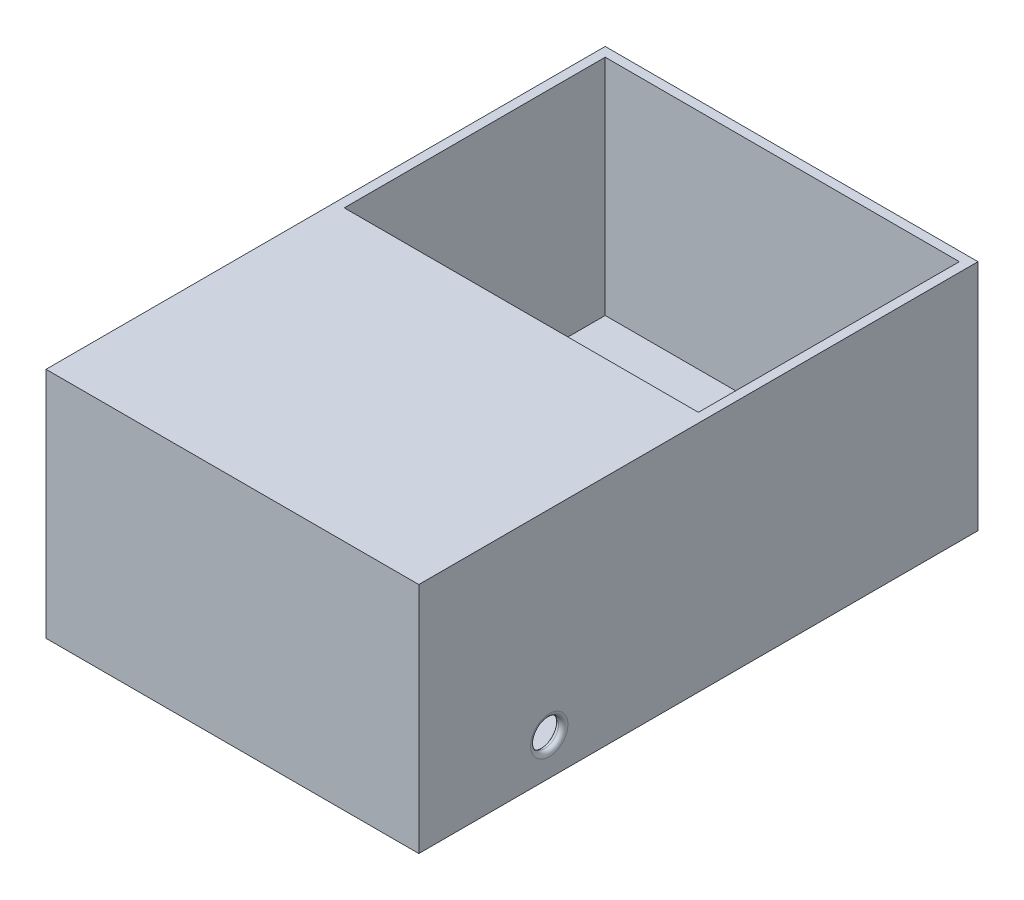
ISO-10303-21;
HEADER;
FILE_DESCRIPTION(('STEP AP214'),'2;1');
FILE_NAME('part.step','',(''),(''),'','','');
FILE_SCHEMA(('AUTOMOTIVE_DESIGN { 1 0 10303 214 1 1 1 1 }'));
ENDSEC;
DATA;
#1=APPLICATION_CONTEXT('core data for automotive mechanical design processes');
#2=APPLICATION_PROTOCOL_DEFINITION('international standard','automotive_design',2000,#1);
#3=PRODUCT_CONTEXT('',#1,'mechanical');
#4=PRODUCT('Part','Part','',(#3));
#5=PRODUCT_RELATED_PRODUCT_CATEGORY('part','',(#4));
#6=PRODUCT_DEFINITION_FORMATION('','',#4);
#7=PRODUCT_DEFINITION_CONTEXT('part definition',#1,'design');
#8=PRODUCT_DEFINITION('design','',#6,#7);
#9=PRODUCT_DEFINITION_SHAPE('','',#8);
#10=(LENGTH_UNIT() NAMED_UNIT(*) SI_UNIT(.MILLI.,.METRE.));
#11=(NAMED_UNIT(*) PLANE_ANGLE_UNIT() SI_UNIT($,.RADIAN.));
#12=(NAMED_UNIT(*) SI_UNIT($,.STERADIAN.) SOLID_ANGLE_UNIT());
#13=UNCERTAINTY_MEASURE_WITH_UNIT(LENGTH_MEASURE(1.E-05),#10,'distance_accuracy_value','');
#14=(GEOMETRIC_REPRESENTATION_CONTEXT(3) GLOBAL_UNCERTAINTY_ASSIGNED_CONTEXT((#13)) GLOBAL_UNIT_ASSIGNED_CONTEXT((#10,
#11,#12)) REPRESENTATION_CONTEXT('',''));
#15=CARTESIAN_POINT('',(0.,0.,0.));
#16=DIRECTION('',(0.,0.,1.));
#17=DIRECTION('',(1.,0.,0.));
#18=AXIS2_PLACEMENT_3D('',#15,#16,#17);
#19=CARTESIAN_POINT('',(-95.,125.,-145.));
#20=DIRECTION('',(1.,0.,0.));
#21=DIRECTION('',(0.,0.,-1.));
#22=AXIS2_PLACEMENT_3D('',#19,#20,#21);
#23=PLANE('',#22);
#24=CARTESIAN_POINT('',(-95.,20.,80.));
#25=DIRECTION('',(1.,0.,0.));
#26=DIRECTION('',(0.,0.,-1.));
#27=AXIS2_PLACEMENT_3D('',#24,#25,#26);
#28=CIRCLE('',#27,10.);
#29=CARTESIAN_POINT('',(-95.,20.,70.));
#30=VERTEX_POINT('',#29);
#31=EDGE_CURVE('E239',#30,#30,#28,.F.);
#32=ORIENTED_EDGE('',*,*,#31,.T.);
#33=EDGE_LOOP('',(#32));
#34=FACE_BOUND('',#33,.T.);
#35=DIRECTION('',(0.,1.,0.));
#36=VECTOR('',#35,1.);
#37=CARTESIAN_POINT('',(-95.,125.,-4.99999999999995));
#38=LINE('',#37,#36);
#39=CARTESIAN_POINT('',(-95.,120.,-4.99999999999995));
#40=VERTEX_POINT('',#39);
#41=CARTESIAN_POINT('',(-95.,125.,-4.99999999999995));
#42=VERTEX_POINT('',#41);
#43=EDGE_CURVE('E61',#40,#42,#38,.T.);
#44=ORIENTED_EDGE('',*,*,#43,.F.);
#45=DIRECTION('',(0.,0.,1.));
#46=VECTOR('',#45,1.);
#47=CARTESIAN_POINT('',(-95.,120.,-4.99999999999995));
#48=LINE('',#47,#46);
#49=CARTESIAN_POINT('',(-95.,120.,145.));
#50=VERTEX_POINT('',#49);
#51=EDGE_CURVE('E134',#40,#50,#48,.T.);
#52=ORIENTED_EDGE('',*,*,#51,.T.);
#53=DIRECTION('',(0.,-1.,0.));
#54=VECTOR('',#53,1.);
#55=CARTESIAN_POINT('',(-95.,125.,145.));
#56=LINE('',#55,#54);
#57=CARTESIAN_POINT('',(-95.,5.,145.));
#58=VERTEX_POINT('',#57);
#59=EDGE_CURVE('E187',#50,#58,#56,.T.);
#60=ORIENTED_EDGE('',*,*,#59,.T.);
#61=DIRECTION('',(0.,0.,1.));
#62=VECTOR('',#61,1.);
#63=CARTESIAN_POINT('',(-95.,5.,-145.));
#64=LINE('',#63,#62);
#65=CARTESIAN_POINT('',(-95.,5.,-145.));
#66=VERTEX_POINT('',#65);
#67=EDGE_CURVE('E172',#66,#58,#64,.T.);
#68=ORIENTED_EDGE('',*,*,#67,.F.);
#69=DIRECTION('',(0.,-1.,0.));
#70=VECTOR('',#69,1.);
#71=CARTESIAN_POINT('',(-95.,125.,-145.));
#72=LINE('',#71,#70);
#73=CARTESIAN_POINT('',(-95.,125.,-145.));
#74=VERTEX_POINT('',#73);
#75=EDGE_CURVE('E190',#74,#66,#72,.T.);
#76=ORIENTED_EDGE('',*,*,#75,.F.);
#77=DIRECTION('',(0.,0.,1.));
#78=VECTOR('',#77,1.);
#79=CARTESIAN_POINT('',(-95.,125.,-145.));
#80=LINE('',#79,#78);
#81=EDGE_CURVE('E66',#74,#42,#80,.T.);
#82=ORIENTED_EDGE('',*,*,#81,.T.);
#83=EDGE_LOOP('',(#44,#52,#60,#68,#76,#82));
#84=FACE_BOUND('',#83,.T.);
#85=ADVANCED_FACE('F43',(#34,#84),#23,.T.);
#86=CARTESIAN_POINT('',(95.,125.,145.));
#87=DIRECTION('',(0.,0.,-1.));
#88=DIRECTION('',(-1.,0.,0.));
#89=AXIS2_PLACEMENT_3D('',#86,#87,#88);
#90=PLANE('',#89);
#91=ORIENTED_EDGE('',*,*,#59,.F.);
#92=DIRECTION('',(-1.,0.,0.));
#93=VECTOR('',#92,1.);
#94=CARTESIAN_POINT('',(95.,120.,145.));
#95=LINE('',#94,#93);
#96=CARTESIAN_POINT('',(95.,120.,145.));
#97=VERTEX_POINT('',#96);
#98=EDGE_CURVE('E147',#97,#50,#95,.T.);
#99=ORIENTED_EDGE('',*,*,#98,.F.);
#100=DIRECTION('',(0.,-1.,0.));
#101=VECTOR('',#100,1.);
#102=CARTESIAN_POINT('',(95.,125.,145.));
#103=LINE('',#102,#101);
#104=CARTESIAN_POINT('',(95.,5.,145.));
#105=VERTEX_POINT('',#104);
#106=EDGE_CURVE('E129',#97,#105,#103,.T.);
#107=ORIENTED_EDGE('',*,*,#106,.T.);
#108=DIRECTION('',(1.,0.,0.));
#109=VECTOR('',#108,1.);
#110=CARTESIAN_POINT('',(95.,5.,145.));
#111=LINE('',#110,#109);
#112=EDGE_CURVE('E176',#58,#105,#111,.T.);
#113=ORIENTED_EDGE('',*,*,#112,.F.);
#114=EDGE_LOOP('',(#91,#99,#107,#113));
#115=FACE_BOUND('',#114,.T.);
#116=ADVANCED_FACE('F272',(#115),#90,.T.);
#117=CARTESIAN_POINT('',(95.,125.,-145.));
#118=DIRECTION('',(-1.,0.,0.));
#119=DIRECTION('',(0.,0.,1.));
#120=AXIS2_PLACEMENT_3D('',#117,#118,#119);
#121=PLANE('',#120);
#122=CARTESIAN_POINT('',(95.,20.,80.));
#123=DIRECTION('',(-1.,0.,0.));
#124=DIRECTION('',(0.,0.,1.));
#125=AXIS2_PLACEMENT_3D('',#122,#123,#124);
#126=CIRCLE('',#125,10.);
#127=CARTESIAN_POINT('',(95.,20.,90.));
#128=VERTEX_POINT('',#127);
#129=EDGE_CURVE('E11',#128,#128,#126,.F.);
#130=ORIENTED_EDGE('',*,*,#129,.T.);
#131=EDGE_LOOP('',(#130));
#132=FACE_BOUND('',#131,.T.);
#133=ORIENTED_EDGE('',*,*,#106,.F.);
#134=DIRECTION('',(0.,0.,1.));
#135=VECTOR('',#134,1.);
#136=CARTESIAN_POINT('',(95.,120.,-4.99999999999995));
#137=LINE('',#136,#135);
#138=CARTESIAN_POINT('',(95.,120.,-4.99999999999995));
#139=VERTEX_POINT('',#138);
#140=EDGE_CURVE('E122',#139,#97,#137,.T.);
#141=ORIENTED_EDGE('',*,*,#140,.F.);
#142=DIRECTION('',(0.,-1.,0.));
#143=VECTOR('',#142,1.);
#144=CARTESIAN_POINT('',(95.,125.,-4.99999999999995));
#145=LINE('',#144,#143);
#146=CARTESIAN_POINT('',(95.,125.,-4.99999999999995));
#147=VERTEX_POINT('',#146);
#148=EDGE_CURVE('E126',#147,#139,#145,.T.);
#149=ORIENTED_EDGE('',*,*,#148,.F.);
#150=DIRECTION('',(0.,0.,-1.));
#151=VECTOR('',#150,1.);
#152=CARTESIAN_POINT('',(95.,125.,-145.));
#153=LINE('',#152,#151);
#154=CARTESIAN_POINT('',(95.,125.,-145.));
#155=VERTEX_POINT('',#154);
#156=EDGE_CURVE('E165',#147,#155,#153,.T.);
#157=ORIENTED_EDGE('',*,*,#156,.T.);
#158=DIRECTION('',(0.,-1.,0.));
#159=VECTOR('',#158,1.);
#160=CARTESIAN_POINT('',(95.,125.,-145.));
#161=LINE('',#160,#159);
#162=CARTESIAN_POINT('',(95.,5.,-145.));
#163=VERTEX_POINT('',#162);
#164=EDGE_CURVE('E168',#155,#163,#161,.T.);
#165=ORIENTED_EDGE('',*,*,#164,.T.);
#166=DIRECTION('',(0.,0.,-1.));
#167=VECTOR('',#166,1.);
#168=CARTESIAN_POINT('',(95.,5.,-145.));
#169=LINE('',#168,#167);
#170=EDGE_CURVE('E162',#105,#163,#169,.T.);
#171=ORIENTED_EDGE('',*,*,#170,.F.);
#172=EDGE_LOOP('',(#133,#141,#149,#157,#165,#171));
#173=FACE_BOUND('',#172,.T.);
#174=ADVANCED_FACE('F124',(#132,#173),#121,.T.);
#175=CARTESIAN_POINT('',(-100.,5.,-150.));
#176=DIRECTION('',(1.,0.,0.));
#177=DIRECTION('',(0.,0.,-1.));
#178=AXIS2_PLACEMENT_3D('',#175,#176,#177);
#179=PLANE('',#178);
#180=CARTESIAN_POINT('',(-100.,20.,80.));
#181=DIRECTION('',(1.,0.,0.));
#182=DIRECTION('',(0.,0.,-1.));
#183=AXIS2_PLACEMENT_3D('',#180,#181,#182);
#184=CIRCLE('',#183,10.);
#185=CARTESIAN_POINT('',(-100.,20.,70.));
#186=VERTEX_POINT('',#185);
#187=EDGE_CURVE('E243',#186,#186,#184,.T.);
#188=ORIENTED_EDGE('',*,*,#187,.T.);
#189=EDGE_LOOP('',(#188));
#190=FACE_BOUND('',#189,.T.);
#191=DIRECTION('',(0.,0.,1.));
#192=VECTOR('',#191,1.);
#193=CARTESIAN_POINT('',(-100.,0.,-150.));
#194=LINE('',#193,#192);
#195=CARTESIAN_POINT('',(-100.,0.,-150.));
#196=VERTEX_POINT('',#195);
#197=CARTESIAN_POINT('',(-100.,0.,150.));
#198=VERTEX_POINT('',#197);
#199=EDGE_CURVE('E210',#196,#198,#194,.T.);
#200=ORIENTED_EDGE('',*,*,#199,.T.);
#201=DIRECTION('',(0.,-1.,0.));
#202=VECTOR('',#201,1.);
#203=CARTESIAN_POINT('',(-100.,5.,150.));
#204=LINE('',#203,#202);
#205=CARTESIAN_POINT('',(-100.,125.,150.));
#206=VERTEX_POINT('',#205);
#207=EDGE_CURVE('E235',#206,#198,#204,.T.);
#208=ORIENTED_EDGE('',*,*,#207,.F.);
#209=DIRECTION('',(0.,0.,1.));
#210=VECTOR('',#209,1.);
#211=CARTESIAN_POINT('',(-100.,125.,-150.));
#212=LINE('',#211,#210);
#213=CARTESIAN_POINT('',(-100.,125.,-150.));
#214=VERTEX_POINT('',#213);
#215=EDGE_CURVE('E194',#214,#206,#212,.T.);
#216=ORIENTED_EDGE('',*,*,#215,.F.);
#217=DIRECTION('',(0.,-1.,0.));
#218=VECTOR('',#217,1.);
#219=CARTESIAN_POINT('',(-100.,5.,-150.));
#220=LINE('',#219,#218);
#221=EDGE_CURVE('E223',#214,#196,#220,.T.);
#222=ORIENTED_EDGE('',*,*,#221,.T.);
#223=EDGE_LOOP('',(#200,#208,#216,#222));
#224=FACE_BOUND('',#223,.T.);
#225=ADVANCED_FACE('F309',(#190,#224),#179,.F.);
#226=CARTESIAN_POINT('',(100.,5.,150.));
#227=DIRECTION('',(0.,0.,-1.));
#228=DIRECTION('',(-1.,0.,0.));
#229=AXIS2_PLACEMENT_3D('',#226,#227,#228);
#230=PLANE('',#229);
#231=DIRECTION('',(1.,0.,0.));
#232=VECTOR('',#231,1.);
#233=CARTESIAN_POINT('',(100.,0.,150.));
#234=LINE('',#233,#232);
#235=CARTESIAN_POINT('',(100.,0.,150.));
#236=VERTEX_POINT('',#235);
#237=EDGE_CURVE('E214',#198,#236,#234,.T.);
#238=ORIENTED_EDGE('',*,*,#237,.T.);
#239=DIRECTION('',(0.,-1.,0.));
#240=VECTOR('',#239,1.);
#241=CARTESIAN_POINT('',(100.,5.,150.));
#242=LINE('',#241,#240);
#243=CARTESIAN_POINT('',(100.,125.,150.));
#244=VERTEX_POINT('',#243);
#245=EDGE_CURVE('E231',#244,#236,#242,.T.);
#246=ORIENTED_EDGE('',*,*,#245,.F.);
#247=DIRECTION('',(1.,0.,0.));
#248=VECTOR('',#247,1.);
#249=CARTESIAN_POINT('',(100.,125.,150.));
#250=LINE('',#249,#248);
#251=EDGE_CURVE('E198',#206,#244,#250,.T.);
#252=ORIENTED_EDGE('',*,*,#251,.F.);
#253=ORIENTED_EDGE('',*,*,#207,.T.);
#254=EDGE_LOOP('',(#238,#246,#252,#253));
#255=FACE_BOUND('',#254,.T.);
#256=ADVANCED_FACE('F305',(#255),#230,.F.);
#257=CARTESIAN_POINT('',(99.9999999999999,5.,-150.));
#258=DIRECTION('',(-1.,0.,0.));
#259=DIRECTION('',(0.,0.,1.));
#260=AXIS2_PLACEMENT_3D('',#257,#258,#259);
#261=PLANE('',#260);
#262=CARTESIAN_POINT('',(100.,20.,80.));
#263=DIRECTION('',(-1.,0.,0.));
#264=DIRECTION('',(0.,0.,1.));
#265=AXIS2_PLACEMENT_3D('',#262,#263,#264);
#266=CIRCLE('',#265,10.);
#267=CARTESIAN_POINT('',(100.,20.,90.));
#268=VERTEX_POINT('',#267);
#269=EDGE_CURVE('E53',#268,#268,#266,.T.);
#270=ORIENTED_EDGE('',*,*,#269,.T.);
#271=EDGE_LOOP('',(#270));
#272=FACE_BOUND('',#271,.T.);
#273=DIRECTION('',(0.,0.,-1.));
#274=VECTOR('',#273,1.);
#275=CARTESIAN_POINT('',(99.9999999999999,0.,-150.));
#276=LINE('',#275,#274);
#277=CARTESIAN_POINT('',(99.9999999999999,0.,-150.));
#278=VERTEX_POINT('',#277);
#279=EDGE_CURVE('E217',#236,#278,#276,.T.);
#280=ORIENTED_EDGE('',*,*,#279,.T.);
#281=DIRECTION('',(0.,-1.,0.));
#282=VECTOR('',#281,1.);
#283=CARTESIAN_POINT('',(99.9999999999999,5.,-150.));
#284=LINE('',#283,#282);
#285=CARTESIAN_POINT('',(100.,125.,-150.));
#286=VERTEX_POINT('',#285);
#287=EDGE_CURVE('E227',#286,#278,#284,.T.);
#288=ORIENTED_EDGE('',*,*,#287,.F.);
#289=DIRECTION('',(0.,0.,-1.));
#290=VECTOR('',#289,1.);
#291=CARTESIAN_POINT('',(100.,125.,-150.));
#292=LINE('',#291,#290);
#293=EDGE_CURVE('E202',#244,#286,#292,.T.);
#294=ORIENTED_EDGE('',*,*,#293,.F.);
#295=ORIENTED_EDGE('',*,*,#245,.T.);
#296=EDGE_LOOP('',(#280,#288,#294,#295));
#297=FACE_BOUND('',#296,.T.);
#298=ADVANCED_FACE('F301',(#272,#297),#261,.F.);
#299=CARTESIAN_POINT('',(99.9999999999999,5.,-150.));
#300=DIRECTION('',(0.,0.,1.));
#301=DIRECTION('',(1.,0.,0.));
#302=AXIS2_PLACEMENT_3D('',#299,#300,#301);
#303=PLANE('',#302);
#304=DIRECTION('',(-1.,0.,0.));
#305=VECTOR('',#304,1.);
#306=CARTESIAN_POINT('',(99.9999999999999,0.,-150.));
#307=LINE('',#306,#305);
#308=EDGE_CURVE('E220',#278,#196,#307,.T.);
#309=ORIENTED_EDGE('',*,*,#308,.T.);
#310=ORIENTED_EDGE('',*,*,#221,.F.);
#311=DIRECTION('',(-1.,0.,0.));
#312=VECTOR('',#311,1.);
#313=CARTESIAN_POINT('',(100.,125.,-150.));
#314=LINE('',#313,#312);
#315=EDGE_CURVE('E206',#286,#214,#314,.T.);
#316=ORIENTED_EDGE('',*,*,#315,.F.);
#317=ORIENTED_EDGE('',*,*,#287,.T.);
#318=EDGE_LOOP('',(#309,#310,#316,#317));
#319=FACE_BOUND('',#318,.T.);
#320=ADVANCED_FACE('F297',(#319),#303,.F.);
#321=CARTESIAN_POINT('',(0.,0.,0.));
#322=DIRECTION('',(0.,-1.,0.));
#323=DIRECTION('',(0.,0.,-1.));
#324=AXIS2_PLACEMENT_3D('',#321,#322,#323);
#325=PLANE('',#324);
#326=ORIENTED_EDGE('',*,*,#199,.F.);
#327=ORIENTED_EDGE('',*,*,#308,.F.);
#328=ORIENTED_EDGE('',*,*,#279,.F.);
#329=ORIENTED_EDGE('',*,*,#237,.F.);
#330=EDGE_LOOP('',(#326,#327,#328,#329));
#331=FACE_BOUND('',#330,.T.);
#332=ADVANCED_FACE('F290',(#331),#325,.T.);
#333=CARTESIAN_POINT('',(0.,125.,0.));
#334=DIRECTION('',(0.,-1.,0.));
#335=DIRECTION('',(0.,0.,-1.));
#336=AXIS2_PLACEMENT_3D('',#333,#334,#335);
#337=PLANE('',#336);
#338=ORIENTED_EDGE('',*,*,#215,.T.);
#339=ORIENTED_EDGE('',*,*,#251,.T.);
#340=ORIENTED_EDGE('',*,*,#293,.T.);
#341=ORIENTED_EDGE('',*,*,#315,.T.);
#342=EDGE_LOOP('',(#338,#339,#340,#341));
#343=FACE_BOUND('',#342,.T.);
#344=DIRECTION('',(-1.,0.,0.));
#345=VECTOR('',#344,1.);
#346=CARTESIAN_POINT('',(95.,125.,-145.));
#347=LINE('',#346,#345);
#348=EDGE_CURVE('E159',#155,#74,#347,.T.);
#349=ORIENTED_EDGE('',*,*,#348,.F.);
#350=ORIENTED_EDGE('',*,*,#156,.F.);
#351=DIRECTION('',(1.,0.,0.));
#352=VECTOR('',#351,1.);
#353=CARTESIAN_POINT('',(95.,125.,-4.99999999999995));
#354=LINE('',#353,#352);
#355=EDGE_CURVE('E145',#42,#147,#354,.T.);
#356=ORIENTED_EDGE('',*,*,#355,.F.);
#357=ORIENTED_EDGE('',*,*,#81,.F.);
#358=EDGE_LOOP('',(#349,#350,#356,#357));
#359=FACE_BOUND('',#358,.T.);
#360=ADVANCED_FACE('F286',(#343,#359),#337,.F.);
#361=CARTESIAN_POINT('',(95.,125.,-145.));
#362=DIRECTION('',(0.,0.,1.));
#363=DIRECTION('',(1.,0.,0.));
#364=AXIS2_PLACEMENT_3D('',#361,#362,#363);
#365=PLANE('',#364);
#366=DIRECTION('',(-1.,0.,0.));
#367=VECTOR('',#366,1.);
#368=CARTESIAN_POINT('',(95.,5.,-145.));
#369=LINE('',#368,#367);
#370=EDGE_CURVE('E133',#163,#66,#369,.T.);
#371=ORIENTED_EDGE('',*,*,#370,.F.);
#372=ORIENTED_EDGE('',*,*,#164,.F.);
#373=ORIENTED_EDGE('',*,*,#348,.T.);
#374=ORIENTED_EDGE('',*,*,#75,.T.);
#375=EDGE_LOOP('',(#371,#372,#373,#374));
#376=FACE_BOUND('',#375,.T.);
#377=ADVANCED_FACE('F282',(#376),#365,.T.);
#378=CARTESIAN_POINT('',(0.,5.,0.));
#379=DIRECTION('',(0.,-1.,0.));
#380=DIRECTION('',(0.,0.,-1.));
#381=AXIS2_PLACEMENT_3D('',#378,#379,#380);
#382=PLANE('',#381);
#383=ORIENTED_EDGE('',*,*,#170,.T.);
#384=ORIENTED_EDGE('',*,*,#370,.T.);
#385=ORIENTED_EDGE('',*,*,#67,.T.);
#386=ORIENTED_EDGE('',*,*,#112,.T.);
#387=EDGE_LOOP('',(#383,#384,#385,#386));
#388=FACE_BOUND('',#387,.T.);
#389=ADVANCED_FACE('F285',(#388),#382,.F.);
#390=CARTESIAN_POINT('',(95.,120.,-4.99999999999995));
#391=DIRECTION('',(0.,1.,0.));
#392=DIRECTION('',(0.,0.,1.));
#393=AXIS2_PLACEMENT_3D('',#390,#391,#392);
#394=PLANE('',#393);
#395=ORIENTED_EDGE('',*,*,#98,.T.);
#396=ORIENTED_EDGE('',*,*,#51,.F.);
#397=DIRECTION('',(-1.,0.,0.));
#398=VECTOR('',#397,1.);
#399=CARTESIAN_POINT('',(95.,120.,-4.99999999999995));
#400=LINE('',#399,#398);
#401=EDGE_CURVE('E137',#139,#40,#400,.T.);
#402=ORIENTED_EDGE('',*,*,#401,.F.);
#403=ORIENTED_EDGE('',*,*,#140,.T.);
#404=EDGE_LOOP('',(#395,#396,#402,#403));
#405=FACE_BOUND('',#404,.T.);
#406=ADVANCED_FACE('F138',(#405),#394,.F.);
#407=CARTESIAN_POINT('',(0.,0.,-4.99999999999995));
#408=DIRECTION('',(0.,0.,-1.));
#409=DIRECTION('',(-1.,0.,0.));
#410=AXIS2_PLACEMENT_3D('',#407,#408,#409);
#411=PLANE('',#410);
#412=ORIENTED_EDGE('',*,*,#148,.T.);
#413=ORIENTED_EDGE('',*,*,#401,.T.);
#414=ORIENTED_EDGE('',*,*,#43,.T.);
#415=ORIENTED_EDGE('',*,*,#355,.T.);
#416=EDGE_LOOP('',(#412,#413,#414,#415));
#417=FACE_BOUND('',#416,.T.);
#418=ADVANCED_FACE('F143',(#417),#411,.T.);
#419=CARTESIAN_POINT('',(-97.5,20.,80.));
#420=DIRECTION('',(1.,0.,0.));
#421=DIRECTION('',(0.,0.,-1.));
#422=AXIS2_PLACEMENT_3D('',#419,#420,#421);
#423=TOROIDAL_SURFACE('',#422,10.,2.5);
#424=ORIENTED_EDGE('',*,*,#187,.F.);
#425=EDGE_LOOP('',(#424));
#426=FACE_BOUND('',#425,.T.);
#427=CARTESIAN_POINT('',(-97.5,20.,80.));
#428=DIRECTION('',(1.,0.,0.));
#429=DIRECTION('',(0.,0.,-1.));
#430=AXIS2_PLACEMENT_3D('',#427,#428,#429);
#431=CIRCLE('',#430,7.5);
#432=CARTESIAN_POINT('',(-97.5,20.,72.5));
#433=VERTEX_POINT('',#432);
#434=EDGE_CURVE('E150',#433,#433,#431,.F.);
#435=ORIENTED_EDGE('',*,*,#434,.F.);
#436=EDGE_LOOP('',(#435));
#437=FACE_BOUND('',#436,.T.);
#438=ADVANCED_FACE('F267',(#426,#437),#423,.T.);
#439=CARTESIAN_POINT('',(-97.5,20.,80.));
#440=DIRECTION('',(1.,0.,0.));
#441=DIRECTION('',(0.,0.,-1.));
#442=AXIS2_PLACEMENT_3D('',#439,#440,#441);
#443=TOROIDAL_SURFACE('',#442,10.,2.5);
#444=ORIENTED_EDGE('',*,*,#31,.F.);
#445=EDGE_LOOP('',(#444));
#446=FACE_BOUND('',#445,.T.);
#447=ORIENTED_EDGE('',*,*,#434,.T.);
#448=EDGE_LOOP('',(#447));
#449=FACE_BOUND('',#448,.T.);
#450=ADVANCED_FACE('F261',(#446,#449),#443,.T.);
#451=CARTESIAN_POINT('',(97.5,20.,80.));
#452=DIRECTION('',(-1.,0.,0.));
#453=DIRECTION('',(0.,0.,1.));
#454=AXIS2_PLACEMENT_3D('',#451,#452,#453);
#455=TOROIDAL_SURFACE('',#454,10.,2.5);
#456=ORIENTED_EDGE('',*,*,#129,.F.);
#457=EDGE_LOOP('',(#456));
#458=FACE_BOUND('',#457,.T.);
#459=CARTESIAN_POINT('',(97.5,20.,80.));
#460=DIRECTION('',(-1.,0.,0.));
#461=DIRECTION('',(0.,0.,1.));
#462=AXIS2_PLACEMENT_3D('',#459,#460,#461);
#463=CIRCLE('',#462,7.5);
#464=CARTESIAN_POINT('',(97.5,20.,87.5));
#465=VERTEX_POINT('',#464);
#466=EDGE_CURVE('E47',#465,#465,#463,.T.);
#467=ORIENTED_EDGE('',*,*,#466,.F.);
#468=EDGE_LOOP('',(#467));
#469=FACE_BOUND('',#468,.T.);
#470=ADVANCED_FACE('F45',(#458,#469),#455,.T.);
#471=CARTESIAN_POINT('',(97.5,20.,80.));
#472=DIRECTION('',(-1.,0.,0.));
#473=DIRECTION('',(0.,0.,1.));
#474=AXIS2_PLACEMENT_3D('',#471,#472,#473);
#475=TOROIDAL_SURFACE('',#474,10.,2.5);
#476=ORIENTED_EDGE('',*,*,#466,.T.);
#477=EDGE_LOOP('',(#476));
#478=FACE_BOUND('',#477,.T.);
#479=ORIENTED_EDGE('',*,*,#269,.F.);
#480=EDGE_LOOP('',(#479));
#481=FACE_BOUND('',#480,.T.);
#482=ADVANCED_FACE('F257',(#478,#481),#475,.T.);
#483=CLOSED_SHELL('',(#85,#116,#174,#225,#256,#298,#320,#332,#360,#377,#389,#406,#418,#438,#450,
#470,#482));
#484=MANIFOLD_SOLID_BREP('B2',#483);
#485=ADVANCED_BREP_SHAPE_REPRESENTATION('',(#18,#484),#14);
#486=SHAPE_DEFINITION_REPRESENTATION(#9,#485);
ENDSEC;
END-ISO-10303-21;
